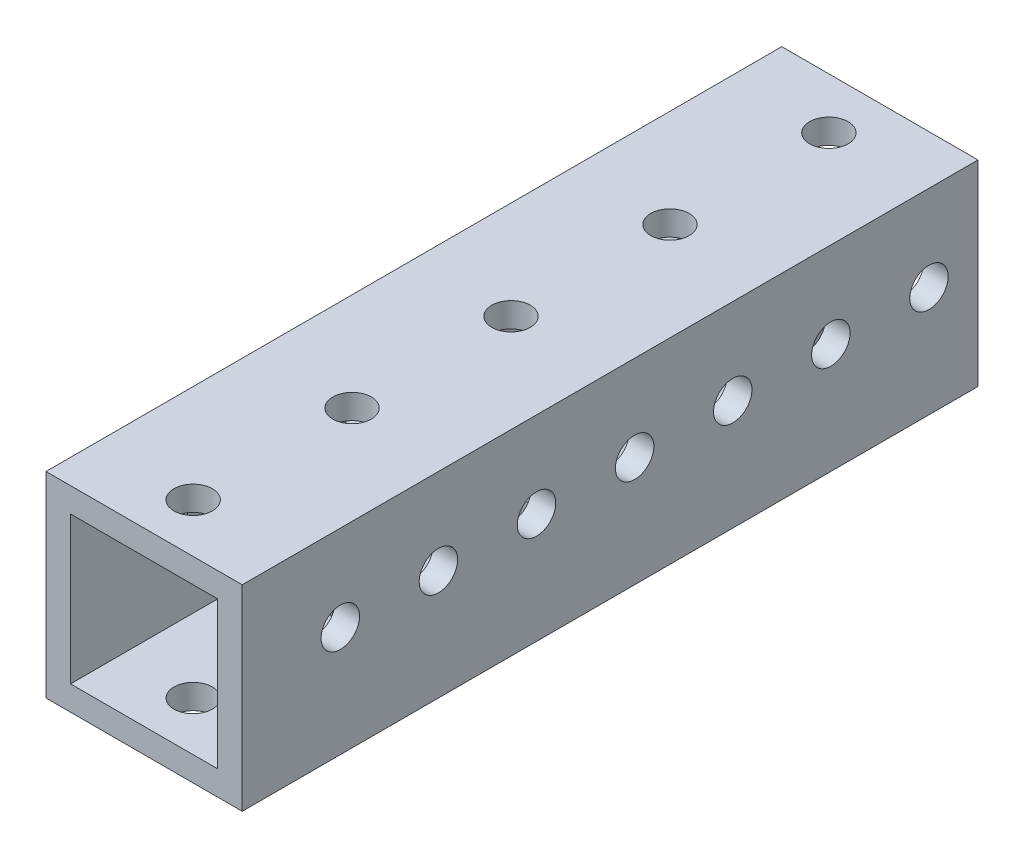
ISO-10303-21;
HEADER;
FILE_DESCRIPTION(('STEP AP214'),'2;1');
FILE_NAME('part.step','',(''),(''),'','','');
FILE_SCHEMA(('AUTOMOTIVE_DESIGN { 1 0 10303 214 1 1 1 1 }'));
ENDSEC;
DATA;
#1=APPLICATION_CONTEXT('core data for automotive mechanical design processes');
#2=APPLICATION_PROTOCOL_DEFINITION('international standard','automotive_design',2000,#1);
#3=PRODUCT_CONTEXT('',#1,'mechanical');
#4=PRODUCT('Part','Part','',(#3));
#5=PRODUCT_RELATED_PRODUCT_CATEGORY('part','',(#4));
#6=PRODUCT_DEFINITION_FORMATION('','',#4);
#7=PRODUCT_DEFINITION_CONTEXT('part definition',#1,'design');
#8=PRODUCT_DEFINITION('design','',#6,#7);
#9=PRODUCT_DEFINITION_SHAPE('','',#8);
#10=(LENGTH_UNIT() NAMED_UNIT(*) SI_UNIT(.MILLI.,.METRE.));
#11=(NAMED_UNIT(*) PLANE_ANGLE_UNIT() SI_UNIT($,.RADIAN.));
#12=(NAMED_UNIT(*) SI_UNIT($,.STERADIAN.) SOLID_ANGLE_UNIT());
#13=UNCERTAINTY_MEASURE_WITH_UNIT(LENGTH_MEASURE(1.E-05),#10,'distance_accuracy_value','');
#14=(GEOMETRIC_REPRESENTATION_CONTEXT(3) GLOBAL_UNCERTAINTY_ASSIGNED_CONTEXT((#13)) GLOBAL_UNIT_ASSIGNED_CONTEXT((#10,
#11,#12)) REPRESENTATION_CONTEXT('',''));
#15=CARTESIAN_POINT('',(0.,0.,0.));
#16=DIRECTION('',(0.,0.,1.));
#17=DIRECTION('',(1.,0.,0.));
#18=AXIS2_PLACEMENT_3D('',#15,#16,#17);
#19=CARTESIAN_POINT('',(0.,0.,95.25));
#20=DIRECTION('',(0.,0.,-1.));
#21=DIRECTION('',(-1.,0.,0.));
#22=AXIS2_PLACEMENT_3D('',#19,#20,#21);
#23=PLANE('',#22);
#24=DIRECTION('',(0.,-1.,0.));
#25=VECTOR('',#24,1.);
#26=CARTESIAN_POINT('',(0.,0.,95.25));
#27=LINE('',#26,#25);
#28=CARTESIAN_POINT('',(0.,25.4,95.25));
#29=VERTEX_POINT('',#28);
#30=CARTESIAN_POINT('',(0.,0.,95.25));
#31=VERTEX_POINT('',#30);
#32=EDGE_CURVE('E138',#29,#31,#27,.T.);
#33=ORIENTED_EDGE('',*,*,#32,.T.);
#34=DIRECTION('',(1.,0.,0.));
#35=VECTOR('',#34,1.);
#36=CARTESIAN_POINT('',(0.,0.,95.25));
#37=LINE('',#36,#35);
#38=CARTESIAN_POINT('',(25.4,0.,95.25));
#39=VERTEX_POINT('',#38);
#40=EDGE_CURVE('E141',#31,#39,#37,.T.);
#41=ORIENTED_EDGE('',*,*,#40,.T.);
#42=DIRECTION('',(0.,1.,0.));
#43=VECTOR('',#42,1.);
#44=CARTESIAN_POINT('',(25.4,0.,95.25));
#45=LINE('',#44,#43);
#46=CARTESIAN_POINT('',(25.4,25.4,95.25));
#47=VERTEX_POINT('',#46);
#48=EDGE_CURVE('E144',#39,#47,#45,.T.);
#49=ORIENTED_EDGE('',*,*,#48,.T.);
#50=DIRECTION('',(-1.,0.,0.));
#51=VECTOR('',#50,1.);
#52=CARTESIAN_POINT('',(0.,25.4,95.25));
#53=LINE('',#52,#51);
#54=EDGE_CURVE('E146',#47,#29,#53,.T.);
#55=ORIENTED_EDGE('',*,*,#54,.T.);
#56=EDGE_LOOP('',(#33,#41,#49,#55));
#57=FACE_BOUND('',#56,.T.);
#58=DIRECTION('',(0.,-1.,0.));
#59=VECTOR('',#58,1.);
#60=CARTESIAN_POINT('',(3.175,3.175,95.25));
#61=LINE('',#60,#59);
#62=CARTESIAN_POINT('',(3.175,22.225,95.25));
#63=VERTEX_POINT('',#62);
#64=CARTESIAN_POINT('',(3.175,3.175,95.25));
#65=VERTEX_POINT('',#64);
#66=EDGE_CURVE('E100',#63,#65,#61,.T.);
#67=ORIENTED_EDGE('',*,*,#66,.F.);
#68=DIRECTION('',(-1.,0.,0.));
#69=VECTOR('',#68,1.);
#70=CARTESIAN_POINT('',(3.175,22.225,95.25));
#71=LINE('',#70,#69);
#72=CARTESIAN_POINT('',(22.225,22.225,95.25));
#73=VERTEX_POINT('',#72);
#74=EDGE_CURVE('E122',#73,#63,#71,.T.);
#75=ORIENTED_EDGE('',*,*,#74,.F.);
#76=DIRECTION('',(0.,1.,0.));
#77=VECTOR('',#76,1.);
#78=CARTESIAN_POINT('',(22.225,3.175,95.25));
#79=LINE('',#78,#77);
#80=CARTESIAN_POINT('',(22.225,3.175,95.25));
#81=VERTEX_POINT('',#80);
#82=EDGE_CURVE('E120',#81,#73,#79,.T.);
#83=ORIENTED_EDGE('',*,*,#82,.F.);
#84=DIRECTION('',(1.,0.,0.));
#85=VECTOR('',#84,1.);
#86=CARTESIAN_POINT('',(3.175,3.175,95.25));
#87=LINE('',#86,#85);
#88=EDGE_CURVE('E108',#65,#81,#87,.T.);
#89=ORIENTED_EDGE('',*,*,#88,.F.);
#90=EDGE_LOOP('',(#67,#75,#83,#89));
#91=FACE_BOUND('',#90,.T.);
#92=ADVANCED_FACE('F33',(#57,#91),#23,.F.);
#93=CARTESIAN_POINT('',(0.,0.,0.));
#94=DIRECTION('',(0.,0.,-1.));
#95=DIRECTION('',(-1.,0.,0.));
#96=AXIS2_PLACEMENT_3D('',#93,#94,#95);
#97=PLANE('',#96);
#98=DIRECTION('',(0.,-1.,0.));
#99=VECTOR('',#98,1.);
#100=CARTESIAN_POINT('',(0.,0.,0.));
#101=LINE('',#100,#99);
#102=CARTESIAN_POINT('',(0.,25.4,0.));
#103=VERTEX_POINT('',#102);
#104=CARTESIAN_POINT('',(0.,0.,0.));
#105=VERTEX_POINT('',#104);
#106=EDGE_CURVE('E116',#103,#105,#101,.T.);
#107=ORIENTED_EDGE('',*,*,#106,.F.);
#108=DIRECTION('',(-1.,0.,0.));
#109=VECTOR('',#108,1.);
#110=CARTESIAN_POINT('',(0.,25.4,0.));
#111=LINE('',#110,#109);
#112=CARTESIAN_POINT('',(25.4,25.4,0.));
#113=VERTEX_POINT('',#112);
#114=EDGE_CURVE('E142',#113,#103,#111,.T.);
#115=ORIENTED_EDGE('',*,*,#114,.F.);
#116=DIRECTION('',(0.,1.,0.));
#117=VECTOR('',#116,1.);
#118=CARTESIAN_POINT('',(25.4,0.,0.));
#119=LINE('',#118,#117);
#120=CARTESIAN_POINT('',(25.4,0.,0.));
#121=VERTEX_POINT('',#120);
#122=EDGE_CURVE('E153',#121,#113,#119,.T.);
#123=ORIENTED_EDGE('',*,*,#122,.F.);
#124=DIRECTION('',(1.,0.,0.));
#125=VECTOR('',#124,1.);
#126=CARTESIAN_POINT('',(0.,0.,0.));
#127=LINE('',#126,#125);
#128=EDGE_CURVE('E151',#105,#121,#127,.T.);
#129=ORIENTED_EDGE('',*,*,#128,.F.);
#130=EDGE_LOOP('',(#107,#115,#123,#129));
#131=FACE_BOUND('',#130,.T.);
#132=DIRECTION('',(-1.,0.,0.));
#133=VECTOR('',#132,1.);
#134=CARTESIAN_POINT('',(3.175,22.225,0.));
#135=LINE('',#134,#133);
#136=CARTESIAN_POINT('',(22.225,22.225,0.));
#137=VERTEX_POINT('',#136);
#138=CARTESIAN_POINT('',(3.175,22.225,0.));
#139=VERTEX_POINT('',#138);
#140=EDGE_CURVE('E109',#137,#139,#135,.T.);
#141=ORIENTED_EDGE('',*,*,#140,.T.);
#142=DIRECTION('',(0.,-1.,0.));
#143=VECTOR('',#142,1.);
#144=CARTESIAN_POINT('',(3.175,3.175,0.));
#145=LINE('',#144,#143);
#146=CARTESIAN_POINT('',(3.175,3.175,0.));
#147=VERTEX_POINT('',#146);
#148=EDGE_CURVE('E58',#139,#147,#145,.T.);
#149=ORIENTED_EDGE('',*,*,#148,.T.);
#150=DIRECTION('',(1.,0.,0.));
#151=VECTOR('',#150,1.);
#152=CARTESIAN_POINT('',(3.175,3.175,0.));
#153=LINE('',#152,#151);
#154=CARTESIAN_POINT('',(22.225,3.175,0.));
#155=VERTEX_POINT('',#154);
#156=EDGE_CURVE('E115',#147,#155,#153,.T.);
#157=ORIENTED_EDGE('',*,*,#156,.T.);
#158=DIRECTION('',(0.,1.,0.));
#159=VECTOR('',#158,1.);
#160=CARTESIAN_POINT('',(22.225,3.175,0.));
#161=LINE('',#160,#159);
#162=EDGE_CURVE('E130',#155,#137,#161,.T.);
#163=ORIENTED_EDGE('',*,*,#162,.T.);
#164=EDGE_LOOP('',(#141,#149,#157,#163));
#165=FACE_BOUND('',#164,.T.);
#166=ADVANCED_FACE('F312',(#131,#165),#97,.T.);
#167=CARTESIAN_POINT('',(0.,0.,95.25));
#168=DIRECTION('',(1.,0.,0.));
#169=DIRECTION('',(0.,0.,-1.));
#170=AXIS2_PLACEMENT_3D('',#167,#168,#169);
#171=PLANE('',#170);
#172=CARTESIAN_POINT('',(0.,14.2875,82.55));
#173=DIRECTION('',(-1.,0.,0.));
#174=DIRECTION('',(0.,0.,1.));
#175=AXIS2_PLACEMENT_3D('',#172,#173,#174);
#176=CIRCLE('',#175,2.4892);
#177=CARTESIAN_POINT('',(0.,14.2875,85.0392));
#178=VERTEX_POINT('',#177);
#179=EDGE_CURVE('E167',#178,#178,#176,.T.);
#180=ORIENTED_EDGE('',*,*,#179,.F.);
#181=EDGE_LOOP('',(#180));
#182=FACE_BOUND('',#181,.T.);
#183=CARTESIAN_POINT('',(0.,14.2875,69.85));
#184=DIRECTION('',(-1.,0.,0.));
#185=DIRECTION('',(0.,0.,1.));
#186=AXIS2_PLACEMENT_3D('',#183,#184,#185);
#187=CIRCLE('',#186,2.4892);
#188=CARTESIAN_POINT('',(0.,14.2875,72.3392));
#189=VERTEX_POINT('',#188);
#190=EDGE_CURVE('E240',#189,#189,#187,.T.);
#191=ORIENTED_EDGE('',*,*,#190,.F.);
#192=EDGE_LOOP('',(#191));
#193=FACE_BOUND('',#192,.T.);
#194=CARTESIAN_POINT('',(0.,14.2875,57.15));
#195=DIRECTION('',(-1.,0.,0.));
#196=DIRECTION('',(0.,0.,1.));
#197=AXIS2_PLACEMENT_3D('',#194,#195,#196);
#198=CIRCLE('',#197,2.4892);
#199=CARTESIAN_POINT('',(0.,14.2875,59.6392));
#200=VERTEX_POINT('',#199);
#201=EDGE_CURVE('E243',#200,#200,#198,.T.);
#202=ORIENTED_EDGE('',*,*,#201,.F.);
#203=EDGE_LOOP('',(#202));
#204=FACE_BOUND('',#203,.T.);
#205=CARTESIAN_POINT('',(0.,14.2875,44.45));
#206=DIRECTION('',(-1.,0.,0.));
#207=DIRECTION('',(0.,0.,1.));
#208=AXIS2_PLACEMENT_3D('',#205,#206,#207);
#209=CIRCLE('',#208,2.4892);
#210=CARTESIAN_POINT('',(0.,14.2875,46.9392));
#211=VERTEX_POINT('',#210);
#212=EDGE_CURVE('E246',#211,#211,#209,.T.);
#213=ORIENTED_EDGE('',*,*,#212,.F.);
#214=EDGE_LOOP('',(#213));
#215=FACE_BOUND('',#214,.T.);
#216=CARTESIAN_POINT('',(0.,14.2875,31.75));
#217=DIRECTION('',(-1.,0.,0.));
#218=DIRECTION('',(0.,0.,1.));
#219=AXIS2_PLACEMENT_3D('',#216,#217,#218);
#220=CIRCLE('',#219,2.4892);
#221=CARTESIAN_POINT('',(0.,14.2875,34.2392));
#222=VERTEX_POINT('',#221);
#223=EDGE_CURVE('E249',#222,#222,#220,.T.);
#224=ORIENTED_EDGE('',*,*,#223,.F.);
#225=EDGE_LOOP('',(#224));
#226=FACE_BOUND('',#225,.T.);
#227=CARTESIAN_POINT('',(0.,14.2875,19.05));
#228=DIRECTION('',(-1.,0.,0.));
#229=DIRECTION('',(0.,0.,1.));
#230=AXIS2_PLACEMENT_3D('',#227,#228,#229);
#231=CIRCLE('',#230,2.4892);
#232=CARTESIAN_POINT('',(0.,14.2875,21.5392));
#233=VERTEX_POINT('',#232);
#234=EDGE_CURVE('E252',#233,#233,#231,.T.);
#235=ORIENTED_EDGE('',*,*,#234,.F.);
#236=EDGE_LOOP('',(#235));
#237=FACE_BOUND('',#236,.T.);
#238=CARTESIAN_POINT('',(0.,14.2875,6.34999999999998));
#239=DIRECTION('',(-1.,0.,0.));
#240=DIRECTION('',(0.,0.,1.));
#241=AXIS2_PLACEMENT_3D('',#238,#239,#240);
#242=CIRCLE('',#241,2.4892);
#243=CARTESIAN_POINT('',(0.,14.2875,8.83919999999998));
#244=VERTEX_POINT('',#243);
#245=EDGE_CURVE('E237',#244,#244,#242,.T.);
#246=ORIENTED_EDGE('',*,*,#245,.F.);
#247=EDGE_LOOP('',(#246));
#248=FACE_BOUND('',#247,.T.);
#249=ORIENTED_EDGE('',*,*,#106,.T.);
#250=DIRECTION('',(0.,0.,-1.));
#251=VECTOR('',#250,1.);
#252=CARTESIAN_POINT('',(0.,0.,95.25));
#253=LINE('',#252,#251);
#254=EDGE_CURVE('E11',#31,#105,#253,.T.);
#255=ORIENTED_EDGE('',*,*,#254,.F.);
#256=ORIENTED_EDGE('',*,*,#32,.F.);
#257=DIRECTION('',(0.,0.,-1.));
#258=VECTOR('',#257,1.);
#259=CARTESIAN_POINT('',(0.,25.4,95.25));
#260=LINE('',#259,#258);
#261=EDGE_CURVE('E148',#29,#103,#260,.T.);
#262=ORIENTED_EDGE('',*,*,#261,.T.);
#263=EDGE_LOOP('',(#249,#255,#256,#262));
#264=FACE_BOUND('',#263,.T.);
#265=ADVANCED_FACE('F35',(#182,#193,#204,#215,#226,#237,#248,#264),#171,.F.);
#266=CARTESIAN_POINT('',(0.,0.,95.25));
#267=DIRECTION('',(0.,1.,0.));
#268=DIRECTION('',(0.,0.,1.));
#269=AXIS2_PLACEMENT_3D('',#266,#267,#268);
#270=PLANE('',#269);
#271=CARTESIAN_POINT('',(12.7,0.,88.9));
#272=DIRECTION('',(0.,-1.,0.));
#273=DIRECTION('',(0.,0.,-1.));
#274=AXIS2_PLACEMENT_3D('',#271,#272,#273);
#275=CIRCLE('',#274,2.4892);
#276=CARTESIAN_POINT('',(12.7,0.,86.4108));
#277=VERTEX_POINT('',#276);
#278=EDGE_CURVE('E202',#277,#277,#275,.T.);
#279=ORIENTED_EDGE('',*,*,#278,.F.);
#280=EDGE_LOOP('',(#279));
#281=FACE_BOUND('',#280,.T.);
#282=CARTESIAN_POINT('',(12.7,0.,68.326));
#283=DIRECTION('',(0.,-1.,0.));
#284=DIRECTION('',(0.,0.,-1.));
#285=AXIS2_PLACEMENT_3D('',#282,#283,#284);
#286=CIRCLE('',#285,2.48919999999999);
#287=CARTESIAN_POINT('',(12.7,0.,65.8368));
#288=VERTEX_POINT('',#287);
#289=EDGE_CURVE('E342',#288,#288,#286,.T.);
#290=ORIENTED_EDGE('',*,*,#289,.F.);
#291=EDGE_LOOP('',(#290));
#292=FACE_BOUND('',#291,.T.);
#293=CARTESIAN_POINT('',(12.7,0.,47.752));
#294=DIRECTION('',(0.,-1.,0.));
#295=DIRECTION('',(0.,0.,-1.));
#296=AXIS2_PLACEMENT_3D('',#293,#294,#295);
#297=CIRCLE('',#296,2.4892);
#298=CARTESIAN_POINT('',(12.7,0.,45.2628));
#299=VERTEX_POINT('',#298);
#300=EDGE_CURVE('E346',#299,#299,#297,.T.);
#301=ORIENTED_EDGE('',*,*,#300,.F.);
#302=EDGE_LOOP('',(#301));
#303=FACE_BOUND('',#302,.T.);
#304=CARTESIAN_POINT('',(12.7,0.,27.178));
#305=DIRECTION('',(0.,-1.,0.));
#306=DIRECTION('',(0.,0.,-1.));
#307=AXIS2_PLACEMENT_3D('',#304,#305,#306);
#308=CIRCLE('',#307,2.4892);
#309=CARTESIAN_POINT('',(12.7,0.,24.6888));
#310=VERTEX_POINT('',#309);
#311=EDGE_CURVE('E350',#310,#310,#308,.T.);
#312=ORIENTED_EDGE('',*,*,#311,.F.);
#313=EDGE_LOOP('',(#312));
#314=FACE_BOUND('',#313,.T.);
#315=CARTESIAN_POINT('',(12.7,0.,6.604));
#316=DIRECTION('',(0.,-1.,0.));
#317=DIRECTION('',(0.,0.,-1.));
#318=AXIS2_PLACEMENT_3D('',#315,#316,#317);
#319=CIRCLE('',#318,2.4892);
#320=CARTESIAN_POINT('',(12.7,0.,4.1148));
#321=VERTEX_POINT('',#320);
#322=EDGE_CURVE('E354',#321,#321,#319,.T.);
#323=ORIENTED_EDGE('',*,*,#322,.F.);
#324=EDGE_LOOP('',(#323));
#325=FACE_BOUND('',#324,.T.);
#326=ORIENTED_EDGE('',*,*,#128,.T.);
#327=DIRECTION('',(0.,0.,-1.));
#328=VECTOR('',#327,1.);
#329=CARTESIAN_POINT('',(25.4,0.,95.25));
#330=LINE('',#329,#328);
#331=EDGE_CURVE('E42',#39,#121,#330,.T.);
#332=ORIENTED_EDGE('',*,*,#331,.F.);
#333=ORIENTED_EDGE('',*,*,#40,.F.);
#334=ORIENTED_EDGE('',*,*,#254,.T.);
#335=EDGE_LOOP('',(#326,#332,#333,#334));
#336=FACE_BOUND('',#335,.T.);
#337=ADVANCED_FACE('F328',(#281,#292,#303,#314,#325,#336),#270,.F.);
#338=CARTESIAN_POINT('',(25.4,0.,95.25));
#339=DIRECTION('',(-1.,0.,0.));
#340=DIRECTION('',(0.,0.,1.));
#341=AXIS2_PLACEMENT_3D('',#338,#339,#340);
#342=PLANE('',#341);
#343=CARTESIAN_POINT('',(25.4,14.2875,82.55));
#344=DIRECTION('',(-1.,0.,0.));
#345=DIRECTION('',(0.,0.,1.));
#346=AXIS2_PLACEMENT_3D('',#343,#344,#345);
#347=CIRCLE('',#346,2.4892);
#348=CARTESIAN_POINT('',(25.4,14.2875,85.0392));
#349=VERTEX_POINT('',#348);
#350=EDGE_CURVE('E128',#349,#349,#347,.T.);
#351=ORIENTED_EDGE('',*,*,#350,.T.);
#352=EDGE_LOOP('',(#351));
#353=FACE_BOUND('',#352,.T.);
#354=CARTESIAN_POINT('',(25.4,14.2875,69.85));
#355=DIRECTION('',(-1.,0.,0.));
#356=DIRECTION('',(0.,0.,1.));
#357=AXIS2_PLACEMENT_3D('',#354,#355,#356);
#358=CIRCLE('',#357,2.4892);
#359=CARTESIAN_POINT('',(25.4,14.2875,72.3392));
#360=VERTEX_POINT('',#359);
#361=EDGE_CURVE('E197',#360,#360,#358,.T.);
#362=ORIENTED_EDGE('',*,*,#361,.T.);
#363=EDGE_LOOP('',(#362));
#364=FACE_BOUND('',#363,.T.);
#365=CARTESIAN_POINT('',(25.4,14.2875,57.15));
#366=DIRECTION('',(-1.,0.,0.));
#367=DIRECTION('',(0.,0.,1.));
#368=AXIS2_PLACEMENT_3D('',#365,#366,#367);
#369=CIRCLE('',#368,2.4892);
#370=CARTESIAN_POINT('',(25.4,14.2875,59.6392));
#371=VERTEX_POINT('',#370);
#372=EDGE_CURVE('E192',#371,#371,#369,.T.);
#373=ORIENTED_EDGE('',*,*,#372,.T.);
#374=EDGE_LOOP('',(#373));
#375=FACE_BOUND('',#374,.T.);
#376=CARTESIAN_POINT('',(25.4,14.2875,44.45));
#377=DIRECTION('',(-1.,0.,0.));
#378=DIRECTION('',(0.,0.,1.));
#379=AXIS2_PLACEMENT_3D('',#376,#377,#378);
#380=CIRCLE('',#379,2.4892);
#381=CARTESIAN_POINT('',(25.4,14.2875,46.9392));
#382=VERTEX_POINT('',#381);
#383=EDGE_CURVE('E187',#382,#382,#380,.T.);
#384=ORIENTED_EDGE('',*,*,#383,.T.);
#385=EDGE_LOOP('',(#384));
#386=FACE_BOUND('',#385,.T.);
#387=CARTESIAN_POINT('',(25.4,14.2875,31.75));
#388=DIRECTION('',(-1.,0.,0.));
#389=DIRECTION('',(0.,0.,1.));
#390=AXIS2_PLACEMENT_3D('',#387,#388,#389);
#391=CIRCLE('',#390,2.4892);
#392=CARTESIAN_POINT('',(25.4,14.2875,34.2392));
#393=VERTEX_POINT('',#392);
#394=EDGE_CURVE('E182',#393,#393,#391,.T.);
#395=ORIENTED_EDGE('',*,*,#394,.T.);
#396=EDGE_LOOP('',(#395));
#397=FACE_BOUND('',#396,.T.);
#398=CARTESIAN_POINT('',(25.4,14.2875,19.05));
#399=DIRECTION('',(-1.,0.,0.));
#400=DIRECTION('',(0.,0.,1.));
#401=AXIS2_PLACEMENT_3D('',#398,#399,#400);
#402=CIRCLE('',#401,2.4892);
#403=CARTESIAN_POINT('',(25.4,14.2875,21.5392));
#404=VERTEX_POINT('',#403);
#405=EDGE_CURVE('E177',#404,#404,#402,.T.);
#406=ORIENTED_EDGE('',*,*,#405,.T.);
#407=EDGE_LOOP('',(#406));
#408=FACE_BOUND('',#407,.T.);
#409=CARTESIAN_POINT('',(25.4,14.2875,6.34999999999998));
#410=DIRECTION('',(-1.,0.,0.));
#411=DIRECTION('',(0.,0.,1.));
#412=AXIS2_PLACEMENT_3D('',#409,#410,#411);
#413=CIRCLE('',#412,2.4892);
#414=CARTESIAN_POINT('',(25.4,14.2875,8.83919999999998));
#415=VERTEX_POINT('',#414);
#416=EDGE_CURVE('E172',#415,#415,#413,.T.);
#417=ORIENTED_EDGE('',*,*,#416,.T.);
#418=EDGE_LOOP('',(#417));
#419=FACE_BOUND('',#418,.T.);
#420=ORIENTED_EDGE('',*,*,#122,.T.);
#421=DIRECTION('',(0.,0.,-1.));
#422=VECTOR('',#421,1.);
#423=CARTESIAN_POINT('',(25.4,25.4,95.25));
#424=LINE('',#423,#422);
#425=EDGE_CURVE('E158',#47,#113,#424,.T.);
#426=ORIENTED_EDGE('',*,*,#425,.F.);
#427=ORIENTED_EDGE('',*,*,#48,.F.);
#428=ORIENTED_EDGE('',*,*,#331,.T.);
#429=EDGE_LOOP('',(#420,#426,#427,#428));
#430=FACE_BOUND('',#429,.T.);
#431=ADVANCED_FACE('F285',(#353,#364,#375,#386,#397,#408,#419,#430),#342,.F.);
#432=CARTESIAN_POINT('',(0.,25.4,95.25));
#433=DIRECTION('',(0.,-1.,0.));
#434=DIRECTION('',(0.,0.,-1.));
#435=AXIS2_PLACEMENT_3D('',#432,#433,#434);
#436=PLANE('',#435);
#437=CARTESIAN_POINT('',(12.7,25.4,88.9));
#438=DIRECTION('',(0.,-1.,0.));
#439=DIRECTION('',(0.,0.,-1.));
#440=AXIS2_PLACEMENT_3D('',#437,#438,#439);
#441=CIRCLE('',#440,2.4892);
#442=CARTESIAN_POINT('',(12.7,25.4,86.4108));
#443=VERTEX_POINT('',#442);
#444=EDGE_CURVE('E234',#443,#443,#441,.T.);
#445=ORIENTED_EDGE('',*,*,#444,.T.);
#446=EDGE_LOOP('',(#445));
#447=FACE_BOUND('',#446,.T.);
#448=CARTESIAN_POINT('',(12.7,25.4,68.326));
#449=DIRECTION('',(0.,-1.,0.));
#450=DIRECTION('',(0.,0.,-1.));
#451=AXIS2_PLACEMENT_3D('',#448,#449,#450);
#452=CIRCLE('',#451,2.48919999999999);
#453=CARTESIAN_POINT('',(12.7,25.4,65.8368));
#454=VERTEX_POINT('',#453);
#455=EDGE_CURVE('E219',#454,#454,#452,.T.);
#456=ORIENTED_EDGE('',*,*,#455,.T.);
#457=EDGE_LOOP('',(#456));
#458=FACE_BOUND('',#457,.T.);
#459=CARTESIAN_POINT('',(12.7,25.4,47.752));
#460=DIRECTION('',(0.,-1.,0.));
#461=DIRECTION('',(0.,0.,-1.));
#462=AXIS2_PLACEMENT_3D('',#459,#460,#461);
#463=CIRCLE('',#462,2.4892);
#464=CARTESIAN_POINT('',(12.7,25.4,45.2628));
#465=VERTEX_POINT('',#464);
#466=EDGE_CURVE('E215',#465,#465,#463,.T.);
#467=ORIENTED_EDGE('',*,*,#466,.T.);
#468=EDGE_LOOP('',(#467));
#469=FACE_BOUND('',#468,.T.);
#470=CARTESIAN_POINT('',(12.7,25.4,27.178));
#471=DIRECTION('',(0.,-1.,0.));
#472=DIRECTION('',(0.,0.,-1.));
#473=AXIS2_PLACEMENT_3D('',#470,#471,#472);
#474=CIRCLE('',#473,2.4892);
#475=CARTESIAN_POINT('',(12.7,25.4,24.6888));
#476=VERTEX_POINT('',#475);
#477=EDGE_CURVE('E211',#476,#476,#474,.T.);
#478=ORIENTED_EDGE('',*,*,#477,.T.);
#479=EDGE_LOOP('',(#478));
#480=FACE_BOUND('',#479,.T.);
#481=CARTESIAN_POINT('',(12.7,25.4,6.604));
#482=DIRECTION('',(0.,-1.,0.));
#483=DIRECTION('',(0.,0.,-1.));
#484=AXIS2_PLACEMENT_3D('',#481,#482,#483);
#485=CIRCLE('',#484,2.4892);
#486=CARTESIAN_POINT('',(12.7,25.4,4.1148));
#487=VERTEX_POINT('',#486);
#488=EDGE_CURVE('E207',#487,#487,#485,.T.);
#489=ORIENTED_EDGE('',*,*,#488,.T.);
#490=EDGE_LOOP('',(#489));
#491=FACE_BOUND('',#490,.T.);
#492=ORIENTED_EDGE('',*,*,#114,.T.);
#493=ORIENTED_EDGE('',*,*,#261,.F.);
#494=ORIENTED_EDGE('',*,*,#54,.F.);
#495=ORIENTED_EDGE('',*,*,#425,.T.);
#496=EDGE_LOOP('',(#492,#493,#494,#495));
#497=FACE_BOUND('',#496,.T.);
#498=ADVANCED_FACE('F323',(#447,#458,#469,#480,#491,#497),#436,.F.);
#499=CARTESIAN_POINT('',(3.175,3.175,95.25));
#500=DIRECTION('',(1.,0.,0.));
#501=DIRECTION('',(0.,0.,-1.));
#502=AXIS2_PLACEMENT_3D('',#499,#500,#501);
#503=PLANE('',#502);
#504=CARTESIAN_POINT('',(3.175,14.2875,82.55));
#505=DIRECTION('',(1.,0.,0.));
#506=DIRECTION('',(0.,0.,-1.));
#507=AXIS2_PLACEMENT_3D('',#504,#505,#506);
#508=CIRCLE('',#507,2.4892);
#509=CARTESIAN_POINT('',(3.175,14.2875,80.0608));
#510=VERTEX_POINT('',#509);
#511=EDGE_CURVE('E196',#510,#510,#508,.T.);
#512=ORIENTED_EDGE('',*,*,#511,.F.);
#513=EDGE_LOOP('',(#512));
#514=FACE_BOUND('',#513,.T.);
#515=CARTESIAN_POINT('',(3.175,14.2875,69.85));
#516=DIRECTION('',(1.,0.,0.));
#517=DIRECTION('',(0.,0.,-1.));
#518=AXIS2_PLACEMENT_3D('',#515,#516,#517);
#519=CIRCLE('',#518,2.4892);
#520=CARTESIAN_POINT('',(3.175,14.2875,67.3608));
#521=VERTEX_POINT('',#520);
#522=EDGE_CURVE('E191',#521,#521,#519,.T.);
#523=ORIENTED_EDGE('',*,*,#522,.F.);
#524=EDGE_LOOP('',(#523));
#525=FACE_BOUND('',#524,.T.);
#526=CARTESIAN_POINT('',(3.175,14.2875,57.15));
#527=DIRECTION('',(1.,0.,0.));
#528=DIRECTION('',(0.,0.,-1.));
#529=AXIS2_PLACEMENT_3D('',#526,#527,#528);
#530=CIRCLE('',#529,2.4892);
#531=CARTESIAN_POINT('',(3.175,14.2875,54.6608));
#532=VERTEX_POINT('',#531);
#533=EDGE_CURVE('E186',#532,#532,#530,.T.);
#534=ORIENTED_EDGE('',*,*,#533,.F.);
#535=EDGE_LOOP('',(#534));
#536=FACE_BOUND('',#535,.T.);
#537=CARTESIAN_POINT('',(3.175,14.2875,44.45));
#538=DIRECTION('',(1.,0.,0.));
#539=DIRECTION('',(0.,0.,-1.));
#540=AXIS2_PLACEMENT_3D('',#537,#538,#539);
#541=CIRCLE('',#540,2.4892);
#542=CARTESIAN_POINT('',(3.175,14.2875,41.9608));
#543=VERTEX_POINT('',#542);
#544=EDGE_CURVE('E181',#543,#543,#541,.T.);
#545=ORIENTED_EDGE('',*,*,#544,.F.);
#546=EDGE_LOOP('',(#545));
#547=FACE_BOUND('',#546,.T.);
#548=CARTESIAN_POINT('',(3.175,14.2875,31.75));
#549=DIRECTION('',(1.,0.,0.));
#550=DIRECTION('',(0.,0.,-1.));
#551=AXIS2_PLACEMENT_3D('',#548,#549,#550);
#552=CIRCLE('',#551,2.4892);
#553=CARTESIAN_POINT('',(3.175,14.2875,29.2608));
#554=VERTEX_POINT('',#553);
#555=EDGE_CURVE('E176',#554,#554,#552,.T.);
#556=ORIENTED_EDGE('',*,*,#555,.F.);
#557=EDGE_LOOP('',(#556));
#558=FACE_BOUND('',#557,.T.);
#559=CARTESIAN_POINT('',(3.175,14.2875,19.05));
#560=DIRECTION('',(1.,0.,0.));
#561=DIRECTION('',(0.,0.,-1.));
#562=AXIS2_PLACEMENT_3D('',#559,#560,#561);
#563=CIRCLE('',#562,2.4892);
#564=CARTESIAN_POINT('',(3.175,14.2875,16.5608));
#565=VERTEX_POINT('',#564);
#566=EDGE_CURVE('E171',#565,#565,#563,.T.);
#567=ORIENTED_EDGE('',*,*,#566,.F.);
#568=EDGE_LOOP('',(#567));
#569=FACE_BOUND('',#568,.T.);
#570=CARTESIAN_POINT('',(3.175,14.2875,6.34999999999998));
#571=DIRECTION('',(1.,0.,0.));
#572=DIRECTION('',(0.,0.,-1.));
#573=AXIS2_PLACEMENT_3D('',#570,#571,#572);
#574=CIRCLE('',#573,2.4892);
#575=CARTESIAN_POINT('',(3.175,14.2875,3.86079999999998));
#576=VERTEX_POINT('',#575);
#577=EDGE_CURVE('E166',#576,#576,#574,.T.);
#578=ORIENTED_EDGE('',*,*,#577,.F.);
#579=EDGE_LOOP('',(#578));
#580=FACE_BOUND('',#579,.T.);
#581=ORIENTED_EDGE('',*,*,#148,.F.);
#582=DIRECTION('',(0.,0.,-1.));
#583=VECTOR('',#582,1.);
#584=CARTESIAN_POINT('',(3.175,22.225,95.25));
#585=LINE('',#584,#583);
#586=EDGE_CURVE('E104',#63,#139,#585,.T.);
#587=ORIENTED_EDGE('',*,*,#586,.F.);
#588=ORIENTED_EDGE('',*,*,#66,.T.);
#589=DIRECTION('',(0.,0.,-1.));
#590=VECTOR('',#589,1.);
#591=CARTESIAN_POINT('',(3.175,3.175,95.25));
#592=LINE('',#591,#590);
#593=EDGE_CURVE('E103',#65,#147,#592,.T.);
#594=ORIENTED_EDGE('',*,*,#593,.T.);
#595=EDGE_LOOP('',(#581,#587,#588,#594));
#596=FACE_BOUND('',#595,.T.);
#597=ADVANCED_FACE('F102',(#514,#525,#536,#547,#558,#569,#580,#596),#503,.T.);
#598=CARTESIAN_POINT('',(3.175,3.175,95.25));
#599=DIRECTION('',(0.,1.,0.));
#600=DIRECTION('',(0.,0.,1.));
#601=AXIS2_PLACEMENT_3D('',#598,#599,#600);
#602=PLANE('',#601);
#603=CARTESIAN_POINT('',(12.7,3.175,88.9));
#604=DIRECTION('',(0.,1.,0.));
#605=DIRECTION('',(0.,0.,1.));
#606=AXIS2_PLACEMENT_3D('',#603,#604,#605);
#607=CIRCLE('',#606,2.4892);
#608=CARTESIAN_POINT('',(12.7,3.175,91.3892));
#609=VERTEX_POINT('',#608);
#610=EDGE_CURVE('E231',#609,#609,#607,.T.);
#611=ORIENTED_EDGE('',*,*,#610,.F.);
#612=EDGE_LOOP('',(#611));
#613=FACE_BOUND('',#612,.T.);
#614=CARTESIAN_POINT('',(12.7,3.175,68.326));
#615=DIRECTION('',(0.,1.,0.));
#616=DIRECTION('',(0.,0.,1.));
#617=AXIS2_PLACEMENT_3D('',#614,#615,#616);
#618=CIRCLE('',#617,2.48919999999999);
#619=CARTESIAN_POINT('',(12.7,3.175,70.8152));
#620=VERTEX_POINT('',#619);
#621=EDGE_CURVE('E214',#620,#620,#618,.T.);
#622=ORIENTED_EDGE('',*,*,#621,.F.);
#623=EDGE_LOOP('',(#622));
#624=FACE_BOUND('',#623,.T.);
#625=CARTESIAN_POINT('',(12.7,3.175,47.752));
#626=DIRECTION('',(0.,1.,0.));
#627=DIRECTION('',(0.,0.,1.));
#628=AXIS2_PLACEMENT_3D('',#625,#626,#627);
#629=CIRCLE('',#628,2.4892);
#630=CARTESIAN_POINT('',(12.7,3.175,50.2412));
#631=VERTEX_POINT('',#630);
#632=EDGE_CURVE('E210',#631,#631,#629,.T.);
#633=ORIENTED_EDGE('',*,*,#632,.F.);
#634=EDGE_LOOP('',(#633));
#635=FACE_BOUND('',#634,.T.);
#636=CARTESIAN_POINT('',(12.7,3.175,27.178));
#637=DIRECTION('',(0.,1.,0.));
#638=DIRECTION('',(0.,0.,1.));
#639=AXIS2_PLACEMENT_3D('',#636,#637,#638);
#640=CIRCLE('',#639,2.4892);
#641=CARTESIAN_POINT('',(12.7,3.175,29.6672));
#642=VERTEX_POINT('',#641);
#643=EDGE_CURVE('E206',#642,#642,#640,.T.);
#644=ORIENTED_EDGE('',*,*,#643,.F.);
#645=EDGE_LOOP('',(#644));
#646=FACE_BOUND('',#645,.T.);
#647=CARTESIAN_POINT('',(12.7,3.175,6.604));
#648=DIRECTION('',(0.,1.,0.));
#649=DIRECTION('',(0.,0.,1.));
#650=AXIS2_PLACEMENT_3D('',#647,#648,#649);
#651=CIRCLE('',#650,2.4892);
#652=CARTESIAN_POINT('',(12.7,3.175,9.0932));
#653=VERTEX_POINT('',#652);
#654=EDGE_CURVE('E201',#653,#653,#651,.T.);
#655=ORIENTED_EDGE('',*,*,#654,.F.);
#656=EDGE_LOOP('',(#655));
#657=FACE_BOUND('',#656,.T.);
#658=ORIENTED_EDGE('',*,*,#156,.F.);
#659=ORIENTED_EDGE('',*,*,#593,.F.);
#660=ORIENTED_EDGE('',*,*,#88,.T.);
#661=DIRECTION('',(0.,0.,-1.));
#662=VECTOR('',#661,1.);
#663=CARTESIAN_POINT('',(22.225,3.175,95.25));
#664=LINE('',#663,#662);
#665=EDGE_CURVE('E117',#81,#155,#664,.T.);
#666=ORIENTED_EDGE('',*,*,#665,.T.);
#667=EDGE_LOOP('',(#658,#659,#660,#666));
#668=FACE_BOUND('',#667,.T.);
#669=ADVANCED_FACE('F112',(#613,#624,#635,#646,#657,#668),#602,.T.);
#670=CARTESIAN_POINT('',(22.225,3.175,95.25));
#671=DIRECTION('',(-1.,0.,0.));
#672=DIRECTION('',(0.,0.,1.));
#673=AXIS2_PLACEMENT_3D('',#670,#671,#672);
#674=PLANE('',#673);
#675=CARTESIAN_POINT('',(22.225,14.2875,82.55));
#676=DIRECTION('',(-1.,0.,0.));
#677=DIRECTION('',(0.,0.,1.));
#678=AXIS2_PLACEMENT_3D('',#675,#676,#677);
#679=CIRCLE('',#678,2.4892);
#680=CARTESIAN_POINT('',(22.225,14.2875,85.0392));
#681=VERTEX_POINT('',#680);
#682=EDGE_CURVE('E193',#681,#681,#679,.T.);
#683=ORIENTED_EDGE('',*,*,#682,.F.);
#684=EDGE_LOOP('',(#683));
#685=FACE_BOUND('',#684,.T.);
#686=CARTESIAN_POINT('',(22.225,14.2875,69.85));
#687=DIRECTION('',(-1.,0.,0.));
#688=DIRECTION('',(0.,0.,1.));
#689=AXIS2_PLACEMENT_3D('',#686,#687,#688);
#690=CIRCLE('',#689,2.4892);
#691=CARTESIAN_POINT('',(22.225,14.2875,72.3392));
#692=VERTEX_POINT('',#691);
#693=EDGE_CURVE('E188',#692,#692,#690,.T.);
#694=ORIENTED_EDGE('',*,*,#693,.F.);
#695=EDGE_LOOP('',(#694));
#696=FACE_BOUND('',#695,.T.);
#697=CARTESIAN_POINT('',(22.225,14.2875,57.15));
#698=DIRECTION('',(-1.,0.,0.));
#699=DIRECTION('',(0.,0.,1.));
#700=AXIS2_PLACEMENT_3D('',#697,#698,#699);
#701=CIRCLE('',#700,2.4892);
#702=CARTESIAN_POINT('',(22.225,14.2875,59.6392));
#703=VERTEX_POINT('',#702);
#704=EDGE_CURVE('E183',#703,#703,#701,.T.);
#705=ORIENTED_EDGE('',*,*,#704,.F.);
#706=EDGE_LOOP('',(#705));
#707=FACE_BOUND('',#706,.T.);
#708=CARTESIAN_POINT('',(22.225,14.2875,44.45));
#709=DIRECTION('',(-1.,0.,0.));
#710=DIRECTION('',(0.,0.,1.));
#711=AXIS2_PLACEMENT_3D('',#708,#709,#710);
#712=CIRCLE('',#711,2.4892);
#713=CARTESIAN_POINT('',(22.225,14.2875,46.9392));
#714=VERTEX_POINT('',#713);
#715=EDGE_CURVE('E178',#714,#714,#712,.T.);
#716=ORIENTED_EDGE('',*,*,#715,.F.);
#717=EDGE_LOOP('',(#716));
#718=FACE_BOUND('',#717,.T.);
#719=CARTESIAN_POINT('',(22.225,14.2875,31.75));
#720=DIRECTION('',(-1.,0.,0.));
#721=DIRECTION('',(0.,0.,1.));
#722=AXIS2_PLACEMENT_3D('',#719,#720,#721);
#723=CIRCLE('',#722,2.4892);
#724=CARTESIAN_POINT('',(22.225,14.2875,34.2392));
#725=VERTEX_POINT('',#724);
#726=EDGE_CURVE('E173',#725,#725,#723,.T.);
#727=ORIENTED_EDGE('',*,*,#726,.F.);
#728=EDGE_LOOP('',(#727));
#729=FACE_BOUND('',#728,.T.);
#730=CARTESIAN_POINT('',(22.225,14.2875,19.05));
#731=DIRECTION('',(-1.,0.,0.));
#732=DIRECTION('',(0.,0.,1.));
#733=AXIS2_PLACEMENT_3D('',#730,#731,#732);
#734=CIRCLE('',#733,2.4892);
#735=CARTESIAN_POINT('',(22.225,14.2875,21.5392));
#736=VERTEX_POINT('',#735);
#737=EDGE_CURVE('E168',#736,#736,#734,.T.);
#738=ORIENTED_EDGE('',*,*,#737,.F.);
#739=EDGE_LOOP('',(#738));
#740=FACE_BOUND('',#739,.T.);
#741=CARTESIAN_POINT('',(22.225,14.2875,6.34999999999998));
#742=DIRECTION('',(-1.,0.,0.));
#743=DIRECTION('',(0.,0.,1.));
#744=AXIS2_PLACEMENT_3D('',#741,#742,#743);
#745=CIRCLE('',#744,2.4892);
#746=CARTESIAN_POINT('',(22.225,14.2875,8.83919999999998));
#747=VERTEX_POINT('',#746);
#748=EDGE_CURVE('E163',#747,#747,#745,.T.);
#749=ORIENTED_EDGE('',*,*,#748,.F.);
#750=EDGE_LOOP('',(#749));
#751=FACE_BOUND('',#750,.T.);
#752=ORIENTED_EDGE('',*,*,#162,.F.);
#753=ORIENTED_EDGE('',*,*,#665,.F.);
#754=ORIENTED_EDGE('',*,*,#82,.T.);
#755=DIRECTION('',(0.,0.,-1.));
#756=VECTOR('',#755,1.);
#757=CARTESIAN_POINT('',(22.225,22.225,95.25));
#758=LINE('',#757,#756);
#759=EDGE_CURVE('E50',#73,#137,#758,.T.);
#760=ORIENTED_EDGE('',*,*,#759,.T.);
#761=EDGE_LOOP('',(#752,#753,#754,#760));
#762=FACE_BOUND('',#761,.T.);
#763=ADVANCED_FACE('F372',(#685,#696,#707,#718,#729,#740,#751,#762),#674,.T.);
#764=CARTESIAN_POINT('',(3.175,22.225,95.25));
#765=DIRECTION('',(0.,-1.,0.));
#766=DIRECTION('',(0.,0.,-1.));
#767=AXIS2_PLACEMENT_3D('',#764,#765,#766);
#768=PLANE('',#767);
#769=CARTESIAN_POINT('',(12.7,22.225,88.9));
#770=DIRECTION('',(0.,-1.,0.));
#771=DIRECTION('',(0.,0.,-1.));
#772=AXIS2_PLACEMENT_3D('',#769,#770,#771);
#773=CIRCLE('',#772,2.4892);
#774=CARTESIAN_POINT('',(12.7,22.225,86.4108));
#775=VERTEX_POINT('',#774);
#776=EDGE_CURVE('E37',#775,#775,#773,.T.);
#777=ORIENTED_EDGE('',*,*,#776,.F.);
#778=EDGE_LOOP('',(#777));
#779=FACE_BOUND('',#778,.T.);
#780=CARTESIAN_POINT('',(12.7,22.225,68.326));
#781=DIRECTION('',(0.,-1.,0.));
#782=DIRECTION('',(0.,0.,-1.));
#783=AXIS2_PLACEMENT_3D('',#780,#781,#782);
#784=CIRCLE('',#783,2.48919999999999);
#785=CARTESIAN_POINT('',(12.7,22.225,65.8368));
#786=VERTEX_POINT('',#785);
#787=EDGE_CURVE('E212',#786,#786,#784,.T.);
#788=ORIENTED_EDGE('',*,*,#787,.F.);
#789=EDGE_LOOP('',(#788));
#790=FACE_BOUND('',#789,.T.);
#791=CARTESIAN_POINT('',(12.7,22.225,47.752));
#792=DIRECTION('',(0.,-1.,0.));
#793=DIRECTION('',(0.,0.,-1.));
#794=AXIS2_PLACEMENT_3D('',#791,#792,#793);
#795=CIRCLE('',#794,2.4892);
#796=CARTESIAN_POINT('',(12.7,22.225,45.2628));
#797=VERTEX_POINT('',#796);
#798=EDGE_CURVE('E208',#797,#797,#795,.T.);
#799=ORIENTED_EDGE('',*,*,#798,.F.);
#800=EDGE_LOOP('',(#799));
#801=FACE_BOUND('',#800,.T.);
#802=CARTESIAN_POINT('',(12.7,22.225,27.178));
#803=DIRECTION('',(0.,-1.,0.));
#804=DIRECTION('',(0.,0.,-1.));
#805=AXIS2_PLACEMENT_3D('',#802,#803,#804);
#806=CIRCLE('',#805,2.4892);
#807=CARTESIAN_POINT('',(12.7,22.225,24.6888));
#808=VERTEX_POINT('',#807);
#809=EDGE_CURVE('E203',#808,#808,#806,.T.);
#810=ORIENTED_EDGE('',*,*,#809,.F.);
#811=EDGE_LOOP('',(#810));
#812=FACE_BOUND('',#811,.T.);
#813=CARTESIAN_POINT('',(12.7,22.225,6.604));
#814=DIRECTION('',(0.,-1.,0.));
#815=DIRECTION('',(0.,0.,-1.));
#816=AXIS2_PLACEMENT_3D('',#813,#814,#815);
#817=CIRCLE('',#816,2.4892);
#818=CARTESIAN_POINT('',(12.7,22.225,4.1148));
#819=VERTEX_POINT('',#818);
#820=EDGE_CURVE('E198',#819,#819,#817,.T.);
#821=ORIENTED_EDGE('',*,*,#820,.F.);
#822=EDGE_LOOP('',(#821));
#823=FACE_BOUND('',#822,.T.);
#824=ORIENTED_EDGE('',*,*,#140,.F.);
#825=ORIENTED_EDGE('',*,*,#759,.F.);
#826=ORIENTED_EDGE('',*,*,#74,.T.);
#827=ORIENTED_EDGE('',*,*,#586,.T.);
#828=EDGE_LOOP('',(#824,#825,#826,#827));
#829=FACE_BOUND('',#828,.T.);
#830=ADVANCED_FACE('F370',(#779,#790,#801,#812,#823,#829),#768,.T.);
#831=CARTESIAN_POINT('',(95.25,14.2875,6.34999999999998));
#832=DIRECTION('',(-1.,0.,0.));
#833=DIRECTION('',(0.,0.,1.));
#834=AXIS2_PLACEMENT_3D('',#831,#832,#833);
#835=CYLINDRICAL_SURFACE('',#834,2.4892);
#836=ORIENTED_EDGE('',*,*,#748,.T.);
#837=EDGE_LOOP('',(#836));
#838=FACE_BOUND('',#837,.T.);
#839=ORIENTED_EDGE('',*,*,#416,.F.);
#840=EDGE_LOOP('',(#839));
#841=FACE_BOUND('',#840,.T.);
#842=ADVANCED_FACE('F302',(#838,#841),#835,.F.);
#843=CARTESIAN_POINT('',(95.25,14.2875,19.05));
#844=DIRECTION('',(-1.,0.,0.));
#845=DIRECTION('',(0.,0.,1.));
#846=AXIS2_PLACEMENT_3D('',#843,#844,#845);
#847=CYLINDRICAL_SURFACE('',#846,2.4892);
#848=ORIENTED_EDGE('',*,*,#737,.T.);
#849=EDGE_LOOP('',(#848));
#850=FACE_BOUND('',#849,.T.);
#851=ORIENTED_EDGE('',*,*,#405,.F.);
#852=EDGE_LOOP('',(#851));
#853=FACE_BOUND('',#852,.T.);
#854=ADVANCED_FACE('F380',(#850,#853),#847,.F.);
#855=CARTESIAN_POINT('',(95.25,14.2875,31.75));
#856=DIRECTION('',(-1.,0.,0.));
#857=DIRECTION('',(0.,0.,1.));
#858=AXIS2_PLACEMENT_3D('',#855,#856,#857);
#859=CYLINDRICAL_SURFACE('',#858,2.4892);
#860=ORIENTED_EDGE('',*,*,#726,.T.);
#861=EDGE_LOOP('',(#860));
#862=FACE_BOUND('',#861,.T.);
#863=ORIENTED_EDGE('',*,*,#394,.F.);
#864=EDGE_LOOP('',(#863));
#865=FACE_BOUND('',#864,.T.);
#866=ADVANCED_FACE('F518',(#862,#865),#859,.F.);
#867=CARTESIAN_POINT('',(95.25,14.2875,44.45));
#868=DIRECTION('',(-1.,0.,0.));
#869=DIRECTION('',(0.,0.,1.));
#870=AXIS2_PLACEMENT_3D('',#867,#868,#869);
#871=CYLINDRICAL_SURFACE('',#870,2.4892);
#872=ORIENTED_EDGE('',*,*,#715,.T.);
#873=EDGE_LOOP('',(#872));
#874=FACE_BOUND('',#873,.T.);
#875=ORIENTED_EDGE('',*,*,#383,.F.);
#876=EDGE_LOOP('',(#875));
#877=FACE_BOUND('',#876,.T.);
#878=ADVANCED_FACE('F510',(#874,#877),#871,.F.);
#879=CARTESIAN_POINT('',(95.25,14.2875,57.15));
#880=DIRECTION('',(-1.,0.,0.));
#881=DIRECTION('',(0.,0.,1.));
#882=AXIS2_PLACEMENT_3D('',#879,#880,#881);
#883=CYLINDRICAL_SURFACE('',#882,2.4892);
#884=ORIENTED_EDGE('',*,*,#704,.T.);
#885=EDGE_LOOP('',(#884));
#886=FACE_BOUND('',#885,.T.);
#887=ORIENTED_EDGE('',*,*,#372,.F.);
#888=EDGE_LOOP('',(#887));
#889=FACE_BOUND('',#888,.T.);
#890=ADVANCED_FACE('F303',(#886,#889),#883,.F.);
#891=CARTESIAN_POINT('',(95.25,14.2875,69.85));
#892=DIRECTION('',(-1.,0.,0.));
#893=DIRECTION('',(0.,0.,1.));
#894=AXIS2_PLACEMENT_3D('',#891,#892,#893);
#895=CYLINDRICAL_SURFACE('',#894,2.4892);
#896=ORIENTED_EDGE('',*,*,#693,.T.);
#897=EDGE_LOOP('',(#896));
#898=FACE_BOUND('',#897,.T.);
#899=ORIENTED_EDGE('',*,*,#361,.F.);
#900=EDGE_LOOP('',(#899));
#901=FACE_BOUND('',#900,.T.);
#902=ADVANCED_FACE('F291',(#898,#901),#895,.F.);
#903=CARTESIAN_POINT('',(95.25,14.2875,82.55));
#904=DIRECTION('',(-1.,0.,0.));
#905=DIRECTION('',(0.,0.,1.));
#906=AXIS2_PLACEMENT_3D('',#903,#904,#905);
#907=CYLINDRICAL_SURFACE('',#906,2.4892);
#908=ORIENTED_EDGE('',*,*,#682,.T.);
#909=EDGE_LOOP('',(#908));
#910=FACE_BOUND('',#909,.T.);
#911=ORIENTED_EDGE('',*,*,#350,.F.);
#912=EDGE_LOOP('',(#911));
#913=FACE_BOUND('',#912,.T.);
#914=ADVANCED_FACE('F288',(#910,#913),#907,.F.);
#915=ORIENTED_EDGE('',*,*,#577,.T.);
#916=EDGE_LOOP('',(#915));
#917=FACE_BOUND('',#916,.T.);
#918=ORIENTED_EDGE('',*,*,#245,.T.);
#919=EDGE_LOOP('',(#918));
#920=FACE_BOUND('',#919,.T.);
#921=ADVANCED_FACE('F290',(#917,#920),#835,.F.);
#922=ORIENTED_EDGE('',*,*,#566,.T.);
#923=EDGE_LOOP('',(#922));
#924=FACE_BOUND('',#923,.T.);
#925=ORIENTED_EDGE('',*,*,#234,.T.);
#926=EDGE_LOOP('',(#925));
#927=FACE_BOUND('',#926,.T.);
#928=ADVANCED_FACE('F299',(#924,#927),#847,.F.);
#929=ORIENTED_EDGE('',*,*,#555,.T.);
#930=EDGE_LOOP('',(#929));
#931=FACE_BOUND('',#930,.T.);
#932=ORIENTED_EDGE('',*,*,#223,.T.);
#933=EDGE_LOOP('',(#932));
#934=FACE_BOUND('',#933,.T.);
#935=ADVANCED_FACE('F507',(#931,#934),#859,.F.);
#936=ORIENTED_EDGE('',*,*,#544,.T.);
#937=EDGE_LOOP('',(#936));
#938=FACE_BOUND('',#937,.T.);
#939=ORIENTED_EDGE('',*,*,#212,.T.);
#940=EDGE_LOOP('',(#939));
#941=FACE_BOUND('',#940,.T.);
#942=ADVANCED_FACE('F499',(#938,#941),#871,.F.);
#943=ORIENTED_EDGE('',*,*,#533,.T.);
#944=EDGE_LOOP('',(#943));
#945=FACE_BOUND('',#944,.T.);
#946=ORIENTED_EDGE('',*,*,#201,.T.);
#947=EDGE_LOOP('',(#946));
#948=FACE_BOUND('',#947,.T.);
#949=ADVANCED_FACE('F492',(#945,#948),#883,.F.);
#950=ORIENTED_EDGE('',*,*,#522,.T.);
#951=EDGE_LOOP('',(#950));
#952=FACE_BOUND('',#951,.T.);
#953=ORIENTED_EDGE('',*,*,#190,.T.);
#954=EDGE_LOOP('',(#953));
#955=FACE_BOUND('',#954,.T.);
#956=ADVANCED_FACE('F306',(#952,#955),#895,.F.);
#957=ORIENTED_EDGE('',*,*,#511,.T.);
#958=EDGE_LOOP('',(#957));
#959=FACE_BOUND('',#958,.T.);
#960=ORIENTED_EDGE('',*,*,#179,.T.);
#961=EDGE_LOOP('',(#960));
#962=FACE_BOUND('',#961,.T.);
#963=ADVANCED_FACE('F294',(#959,#962),#907,.F.);
#964=CARTESIAN_POINT('',(12.7,95.25,6.604));
#965=DIRECTION('',(0.,-1.,0.));
#966=DIRECTION('',(0.,0.,-1.));
#967=AXIS2_PLACEMENT_3D('',#964,#965,#966);
#968=CYLINDRICAL_SURFACE('',#967,2.4892);
#969=ORIENTED_EDGE('',*,*,#820,.T.);
#970=EDGE_LOOP('',(#969));
#971=FACE_BOUND('',#970,.T.);
#972=ORIENTED_EDGE('',*,*,#488,.F.);
#973=EDGE_LOOP('',(#972));
#974=FACE_BOUND('',#973,.T.);
#975=ADVANCED_FACE('F309',(#971,#974),#968,.F.);
#976=CARTESIAN_POINT('',(12.7,95.25,27.178));
#977=DIRECTION('',(0.,-1.,0.));
#978=DIRECTION('',(0.,0.,-1.));
#979=AXIS2_PLACEMENT_3D('',#976,#977,#978);
#980=CYLINDRICAL_SURFACE('',#979,2.4892);
#981=ORIENTED_EDGE('',*,*,#809,.T.);
#982=EDGE_LOOP('',(#981));
#983=FACE_BOUND('',#982,.T.);
#984=ORIENTED_EDGE('',*,*,#477,.F.);
#985=EDGE_LOOP('',(#984));
#986=FACE_BOUND('',#985,.T.);
#987=ADVANCED_FACE('F416',(#983,#986),#980,.F.);
#988=CARTESIAN_POINT('',(12.7,95.25,47.752));
#989=DIRECTION('',(0.,-1.,0.));
#990=DIRECTION('',(0.,0.,-1.));
#991=AXIS2_PLACEMENT_3D('',#988,#989,#990);
#992=CYLINDRICAL_SURFACE('',#991,2.4892);
#993=ORIENTED_EDGE('',*,*,#798,.T.);
#994=EDGE_LOOP('',(#993));
#995=FACE_BOUND('',#994,.T.);
#996=ORIENTED_EDGE('',*,*,#466,.F.);
#997=EDGE_LOOP('',(#996));
#998=FACE_BOUND('',#997,.T.);
#999=ADVANCED_FACE('F418',(#995,#998),#992,.F.);
#1000=CARTESIAN_POINT('',(12.7,95.25,68.326));
#1001=DIRECTION('',(0.,-1.,0.));
#1002=DIRECTION('',(0.,0.,-1.));
#1003=AXIS2_PLACEMENT_3D('',#1000,#1001,#1002);
#1004=CYLINDRICAL_SURFACE('',#1003,2.48919999999999);
#1005=ORIENTED_EDGE('',*,*,#787,.T.);
#1006=EDGE_LOOP('',(#1005));
#1007=FACE_BOUND('',#1006,.T.);
#1008=ORIENTED_EDGE('',*,*,#455,.F.);
#1009=EDGE_LOOP('',(#1008));
#1010=FACE_BOUND('',#1009,.T.);
#1011=ADVANCED_FACE('F426',(#1007,#1010),#1004,.F.);
#1012=CARTESIAN_POINT('',(12.7,95.25,88.9));
#1013=DIRECTION('',(0.,-1.,0.));
#1014=DIRECTION('',(0.,0.,-1.));
#1015=AXIS2_PLACEMENT_3D('',#1012,#1013,#1014);
#1016=CYLINDRICAL_SURFACE('',#1015,2.4892);
#1017=ORIENTED_EDGE('',*,*,#776,.T.);
#1018=EDGE_LOOP('',(#1017));
#1019=FACE_BOUND('',#1018,.T.);
#1020=ORIENTED_EDGE('',*,*,#444,.F.);
#1021=EDGE_LOOP('',(#1020));
#1022=FACE_BOUND('',#1021,.T.);
#1023=ADVANCED_FACE('F440',(#1019,#1022),#1016,.F.);
#1024=ORIENTED_EDGE('',*,*,#654,.T.);
#1025=EDGE_LOOP('',(#1024));
#1026=FACE_BOUND('',#1025,.T.);
#1027=ORIENTED_EDGE('',*,*,#322,.T.);
#1028=EDGE_LOOP('',(#1027));
#1029=FACE_BOUND('',#1028,.T.);
#1030=ADVANCED_FACE('F431',(#1026,#1029),#968,.F.);
#1031=ORIENTED_EDGE('',*,*,#643,.T.);
#1032=EDGE_LOOP('',(#1031));
#1033=FACE_BOUND('',#1032,.T.);
#1034=ORIENTED_EDGE('',*,*,#311,.T.);
#1035=EDGE_LOOP('',(#1034));
#1036=FACE_BOUND('',#1035,.T.);
#1037=ADVANCED_FACE('F421',(#1033,#1036),#980,.F.);
#1038=ORIENTED_EDGE('',*,*,#632,.T.);
#1039=EDGE_LOOP('',(#1038));
#1040=FACE_BOUND('',#1039,.T.);
#1041=ORIENTED_EDGE('',*,*,#300,.T.);
#1042=EDGE_LOOP('',(#1041));
#1043=FACE_BOUND('',#1042,.T.);
#1044=ADVANCED_FACE('F429',(#1040,#1043),#992,.F.);
#1045=ORIENTED_EDGE('',*,*,#621,.T.);
#1046=EDGE_LOOP('',(#1045));
#1047=FACE_BOUND('',#1046,.T.);
#1048=ORIENTED_EDGE('',*,*,#289,.T.);
#1049=EDGE_LOOP('',(#1048));
#1050=FACE_BOUND('',#1049,.T.);
#1051=ADVANCED_FACE('F438',(#1047,#1050),#1004,.F.);
#1052=ORIENTED_EDGE('',*,*,#610,.T.);
#1053=EDGE_LOOP('',(#1052));
#1054=FACE_BOUND('',#1053,.T.);
#1055=ORIENTED_EDGE('',*,*,#278,.T.);
#1056=EDGE_LOOP('',(#1055));
#1057=FACE_BOUND('',#1056,.T.);
#1058=ADVANCED_FACE('F446',(#1054,#1057),#1016,.F.);
#1059=CLOSED_SHELL('',(#92,#166,#265,#337,#431,#498,#597,#669,#763,#830,#842,#854,#866,#878,
#890,#902,#914,#921,#928,#935,#942,#949,#956,#963,#975,#987,#999,#1011,#1023,#1030,#1037,#1044,
#1051,#1058));
#1060=MANIFOLD_SOLID_BREP('B2',#1059);
#1061=ADVANCED_BREP_SHAPE_REPRESENTATION('',(#18,#1060),#14);
#1062=SHAPE_DEFINITION_REPRESENTATION(#9,#1061);
ENDSEC;
END-ISO-10303-21;
